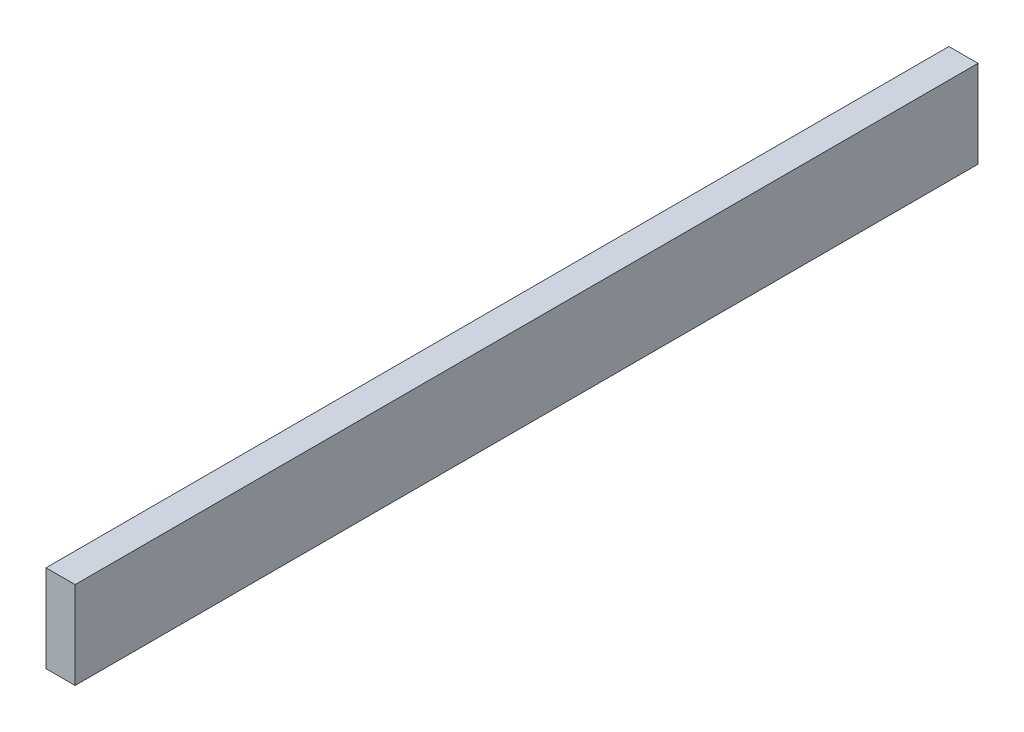
ISO-10303-21;
HEADER;
FILE_DESCRIPTION(('STEP AP214'),'2;1');
FILE_NAME('part.step','',(''),(''),'','','');
FILE_SCHEMA(('AUTOMOTIVE_DESIGN { 1 0 10303 214 1 1 1 1 }'));
ENDSEC;
DATA;
#1=APPLICATION_CONTEXT('core data for automotive mechanical design processes');
#2=APPLICATION_PROTOCOL_DEFINITION('international standard','automotive_design',2000,#1);
#3=PRODUCT_CONTEXT('',#1,'mechanical');
#4=PRODUCT('Part','Part','',(#3));
#5=PRODUCT_RELATED_PRODUCT_CATEGORY('part','',(#4));
#6=PRODUCT_DEFINITION_FORMATION('','',#4);
#7=PRODUCT_DEFINITION_CONTEXT('part definition',#1,'design');
#8=PRODUCT_DEFINITION('design','',#6,#7);
#9=PRODUCT_DEFINITION_SHAPE('','',#8);
#10=(LENGTH_UNIT() NAMED_UNIT(*) SI_UNIT(.MILLI.,.METRE.));
#11=(NAMED_UNIT(*) PLANE_ANGLE_UNIT() SI_UNIT($,.RADIAN.));
#12=(NAMED_UNIT(*) SI_UNIT($,.STERADIAN.) SOLID_ANGLE_UNIT());
#13=UNCERTAINTY_MEASURE_WITH_UNIT(LENGTH_MEASURE(1.E-05),#10,'distance_accuracy_value','');
#14=(GEOMETRIC_REPRESENTATION_CONTEXT(3) GLOBAL_UNCERTAINTY_ASSIGNED_CONTEXT((#13)) GLOBAL_UNIT_ASSIGNED_CONTEXT((#10,
#11,#12)) REPRESENTATION_CONTEXT('',''));
#15=CARTESIAN_POINT('',(0.,0.,0.));
#16=DIRECTION('',(0.,0.,1.));
#17=DIRECTION('',(1.,0.,0.));
#18=AXIS2_PLACEMENT_3D('',#15,#16,#17);
#19=CARTESIAN_POINT('',(12.7,0.,0.));
#20=DIRECTION('',(0.,0.,-1.));
#21=DIRECTION('',(-1.,0.,0.));
#22=AXIS2_PLACEMENT_3D('',#19,#20,#21);
#23=PLANE('',#22);
#24=DIRECTION('',(0.,-1.,0.));
#25=VECTOR('',#24,1.);
#26=CARTESIAN_POINT('',(0.,0.,0.));
#27=LINE('',#26,#25);
#28=CARTESIAN_POINT('',(0.,38.1,0.));
#29=VERTEX_POINT('',#28);
#30=CARTESIAN_POINT('',(0.,0.,0.));
#31=VERTEX_POINT('',#30);
#32=EDGE_CURVE('E107',#29,#31,#27,.T.);
#33=ORIENTED_EDGE('',*,*,#32,.T.);
#34=DIRECTION('',(-1.,0.,0.));
#35=VECTOR('',#34,1.);
#36=CARTESIAN_POINT('',(12.7,0.,0.));
#37=LINE('',#36,#35);
#38=CARTESIAN_POINT('',(12.7,0.,0.));
#39=VERTEX_POINT('',#38);
#40=EDGE_CURVE('E11',#39,#31,#37,.T.);
#41=ORIENTED_EDGE('',*,*,#40,.F.);
#42=DIRECTION('',(0.,-1.,0.));
#43=VECTOR('',#42,1.);
#44=CARTESIAN_POINT('',(12.7,0.,0.));
#45=LINE('',#44,#43);
#46=CARTESIAN_POINT('',(12.7,38.1,0.));
#47=VERTEX_POINT('',#46);
#48=EDGE_CURVE('E91',#47,#39,#45,.T.);
#49=ORIENTED_EDGE('',*,*,#48,.F.);
#50=DIRECTION('',(-1.,0.,0.));
#51=VECTOR('',#50,1.);
#52=CARTESIAN_POINT('',(12.7,38.1,0.));
#53=LINE('',#52,#51);
#54=EDGE_CURVE('E103',#47,#29,#53,.T.);
#55=ORIENTED_EDGE('',*,*,#54,.T.);
#56=EDGE_LOOP('',(#33,#41,#49,#55));
#57=FACE_BOUND('',#56,.T.);
#58=ADVANCED_FACE('F39',(#57),#23,.F.);
#59=CARTESIAN_POINT('',(12.7,0.,0.));
#60=DIRECTION('',(0.,1.,0.));
#61=DIRECTION('',(0.,0.,1.));
#62=AXIS2_PLACEMENT_3D('',#59,#60,#61);
#63=PLANE('',#62);
#64=DIRECTION('',(0.,0.,-1.));
#65=VECTOR('',#64,1.);
#66=CARTESIAN_POINT('',(0.,0.,0.));
#67=LINE('',#66,#65);
#68=CARTESIAN_POINT('',(0.,0.,-393.7));
#69=VERTEX_POINT('',#68);
#70=EDGE_CURVE('E96',#31,#69,#67,.T.);
#71=ORIENTED_EDGE('',*,*,#70,.T.);
#72=DIRECTION('',(-1.,0.,0.));
#73=VECTOR('',#72,1.);
#74=CARTESIAN_POINT('',(12.7,0.,-393.7));
#75=LINE('',#74,#73);
#76=CARTESIAN_POINT('',(12.7,0.,-393.7));
#77=VERTEX_POINT('',#76);
#78=EDGE_CURVE('E48',#77,#69,#75,.T.);
#79=ORIENTED_EDGE('',*,*,#78,.F.);
#80=DIRECTION('',(0.,0.,-1.));
#81=VECTOR('',#80,1.);
#82=CARTESIAN_POINT('',(12.7,0.,0.));
#83=LINE('',#82,#81);
#84=EDGE_CURVE('E86',#39,#77,#83,.T.);
#85=ORIENTED_EDGE('',*,*,#84,.F.);
#86=ORIENTED_EDGE('',*,*,#40,.T.);
#87=EDGE_LOOP('',(#71,#79,#85,#86));
#88=FACE_BOUND('',#87,.T.);
#89=ADVANCED_FACE('F95',(#88),#63,.F.);
#90=CARTESIAN_POINT('',(12.7,0.,-393.7));
#91=DIRECTION('',(0.,0.,1.));
#92=DIRECTION('',(1.,0.,0.));
#93=AXIS2_PLACEMENT_3D('',#90,#91,#92);
#94=PLANE('',#93);
#95=DIRECTION('',(0.,1.,0.));
#96=VECTOR('',#95,1.);
#97=CARTESIAN_POINT('',(0.,0.,-393.7));
#98=LINE('',#97,#96);
#99=CARTESIAN_POINT('',(0.,38.1,-393.7));
#100=VERTEX_POINT('',#99);
#101=EDGE_CURVE('E73',#69,#100,#98,.T.);
#102=ORIENTED_EDGE('',*,*,#101,.T.);
#103=DIRECTION('',(-1.,0.,0.));
#104=VECTOR('',#103,1.);
#105=CARTESIAN_POINT('',(12.7,38.1,-393.7));
#106=LINE('',#105,#104);
#107=CARTESIAN_POINT('',(12.7,38.1,-393.7));
#108=VERTEX_POINT('',#107);
#109=EDGE_CURVE('E98',#108,#100,#106,.T.);
#110=ORIENTED_EDGE('',*,*,#109,.F.);
#111=DIRECTION('',(0.,1.,0.));
#112=VECTOR('',#111,1.);
#113=CARTESIAN_POINT('',(12.7,0.,-393.7));
#114=LINE('',#113,#112);
#115=EDGE_CURVE('E89',#77,#108,#114,.T.);
#116=ORIENTED_EDGE('',*,*,#115,.F.);
#117=ORIENTED_EDGE('',*,*,#78,.T.);
#118=EDGE_LOOP('',(#102,#110,#116,#117));
#119=FACE_BOUND('',#118,.T.);
#120=ADVANCED_FACE('F99',(#119),#94,.F.);
#121=CARTESIAN_POINT('',(12.7,38.1,0.));
#122=DIRECTION('',(0.,-1.,0.));
#123=DIRECTION('',(0.,0.,-1.));
#124=AXIS2_PLACEMENT_3D('',#121,#122,#123);
#125=PLANE('',#124);
#126=DIRECTION('',(0.,0.,1.));
#127=VECTOR('',#126,1.);
#128=CARTESIAN_POINT('',(0.,38.1,0.));
#129=LINE('',#128,#127);
#130=EDGE_CURVE('E79',#100,#29,#129,.T.);
#131=ORIENTED_EDGE('',*,*,#130,.T.);
#132=ORIENTED_EDGE('',*,*,#54,.F.);
#133=DIRECTION('',(0.,0.,1.));
#134=VECTOR('',#133,1.);
#135=CARTESIAN_POINT('',(12.7,38.1,0.));
#136=LINE('',#135,#134);
#137=EDGE_CURVE('E56',#108,#47,#136,.T.);
#138=ORIENTED_EDGE('',*,*,#137,.F.);
#139=ORIENTED_EDGE('',*,*,#109,.T.);
#140=EDGE_LOOP('',(#131,#132,#138,#139));
#141=FACE_BOUND('',#140,.T.);
#142=ADVANCED_FACE('F120',(#141),#125,.F.);
#143=CARTESIAN_POINT('',(12.7,0.,0.));
#144=DIRECTION('',(-1.,0.,0.));
#145=DIRECTION('',(0.,0.,1.));
#146=AXIS2_PLACEMENT_3D('',#143,#144,#145);
#147=PLANE('',#146);
#148=ORIENTED_EDGE('',*,*,#48,.T.);
#149=ORIENTED_EDGE('',*,*,#84,.T.);
#150=ORIENTED_EDGE('',*,*,#115,.T.);
#151=ORIENTED_EDGE('',*,*,#137,.T.);
#152=EDGE_LOOP('',(#148,#149,#150,#151));
#153=FACE_BOUND('',#152,.T.);
#154=ADVANCED_FACE('F87',(#153),#147,.F.);
#155=CARTESIAN_POINT('',(0.,0.,0.));
#156=DIRECTION('',(-1.,0.,0.));
#157=DIRECTION('',(0.,0.,1.));
#158=AXIS2_PLACEMENT_3D('',#155,#156,#157);
#159=PLANE('',#158);
#160=ORIENTED_EDGE('',*,*,#32,.F.);
#161=ORIENTED_EDGE('',*,*,#130,.F.);
#162=ORIENTED_EDGE('',*,*,#101,.F.);
#163=ORIENTED_EDGE('',*,*,#70,.F.);
#164=EDGE_LOOP('',(#160,#161,#162,#163));
#165=FACE_BOUND('',#164,.T.);
#166=ADVANCED_FACE('F123',(#165),#159,.T.);
#167=CLOSED_SHELL('',(#58,#89,#120,#142,#154,#166));
#168=MANIFOLD_SOLID_BREP('B2',#167);
#169=ADVANCED_BREP_SHAPE_REPRESENTATION('',(#18,#168),#14);
#170=SHAPE_DEFINITION_REPRESENTATION(#9,#169);
ENDSEC;
END-ISO-10303-21;
